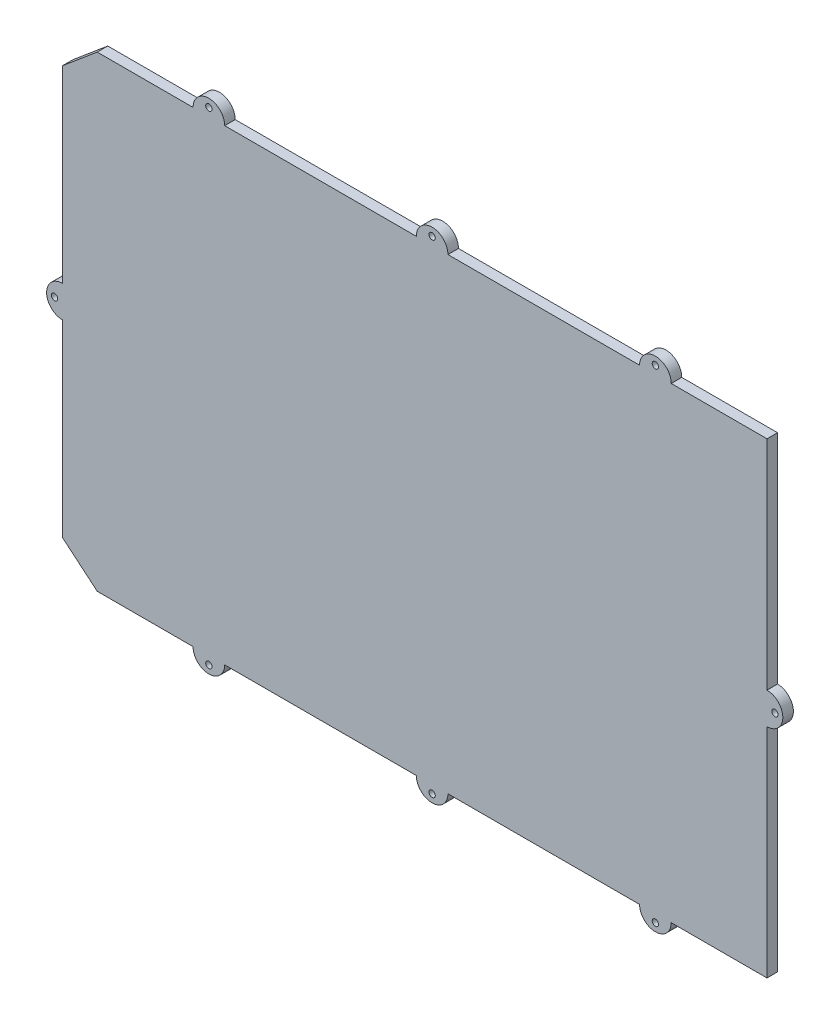
ISO-10303-21;
HEADER;
FILE_DESCRIPTION(('STEP AP214'),'2;1');
FILE_NAME('part.step','',(''),(''),'','','');
FILE_SCHEMA(('AUTOMOTIVE_DESIGN { 1 0 10303 214 1 1 1 1 }'));
ENDSEC;
DATA;
#1=APPLICATION_CONTEXT('core data for automotive mechanical design processes');
#2=APPLICATION_PROTOCOL_DEFINITION('international standard','automotive_design',2000,#1);
#3=PRODUCT_CONTEXT('',#1,'mechanical');
#4=PRODUCT('Part','Part','',(#3));
#5=PRODUCT_RELATED_PRODUCT_CATEGORY('part','',(#4));
#6=PRODUCT_DEFINITION_FORMATION('','',#4);
#7=PRODUCT_DEFINITION_CONTEXT('part definition',#1,'design');
#8=PRODUCT_DEFINITION('design','',#6,#7);
#9=PRODUCT_DEFINITION_SHAPE('','',#8);
#10=(LENGTH_UNIT() NAMED_UNIT(*) SI_UNIT(.MILLI.,.METRE.));
#11=(NAMED_UNIT(*) PLANE_ANGLE_UNIT() SI_UNIT($,.RADIAN.));
#12=(NAMED_UNIT(*) SI_UNIT($,.STERADIAN.) SOLID_ANGLE_UNIT());
#13=UNCERTAINTY_MEASURE_WITH_UNIT(LENGTH_MEASURE(1.E-05),#10,'distance_accuracy_value','');
#14=(GEOMETRIC_REPRESENTATION_CONTEXT(3) GLOBAL_UNCERTAINTY_ASSIGNED_CONTEXT((#13)) GLOBAL_UNIT_ASSIGNED_CONTEXT((#10,
#11,#12)) REPRESENTATION_CONTEXT('',''));
#15=CARTESIAN_POINT('',(0.,0.,0.));
#16=DIRECTION('',(0.,0.,1.));
#17=DIRECTION('',(1.,0.,0.));
#18=AXIS2_PLACEMENT_3D('',#15,#16,#17);
#19=CARTESIAN_POINT('',(319.2,-5.84232335022694,10.));
#20=DIRECTION('',(0.,0.,-1.));
#21=DIRECTION('',(-1.,0.,0.));
#22=AXIS2_PLACEMENT_3D('',#19,#20,#21);
#23=PLANE('',#22);
#24=DIRECTION('',(1.,0.,0.));
#25=VECTOR('',#24,1.);
#26=CARTESIAN_POINT('',(228.3,-227.342323350227,10.));
#27=LINE('',#26,#25);
#28=CARTESIAN_POINT('',(228.3,-227.342323350227,10.));
#29=VERTEX_POINT('',#28);
#30=CARTESIAN_POINT('',(319.2,-227.342323350227,10.));
#31=VERTEX_POINT('',#30);
#32=EDGE_CURVE('E290',#29,#31,#27,.T.);
#33=ORIENTED_EDGE('',*,*,#32,.T.);
#34=DIRECTION('',(0.,1.,0.));
#35=VECTOR('',#34,1.);
#36=CARTESIAN_POINT('',(319.2,-227.342323350227,10.));
#37=LINE('',#36,#35);
#38=CARTESIAN_POINT('',(319.2,-20.8423233502269,10.));
#39=VERTEX_POINT('',#38);
#40=EDGE_CURVE('E142',#31,#39,#37,.T.);
#41=ORIENTED_EDGE('',*,*,#40,.T.);
#42=CARTESIAN_POINT('',(319.2,-5.84232335022694,10.));
#43=DIRECTION('',(0.,0.,1.));
#44=DIRECTION('',(-1.,0.,0.));
#45=AXIS2_PLACEMENT_3D('',#42,#43,#44);
#46=CIRCLE('',#45,15.);
#47=CARTESIAN_POINT('',(319.2,9.15767664977306,10.));
#48=VERTEX_POINT('',#47);
#49=EDGE_CURVE('E367',#39,#48,#46,.T.);
#50=ORIENTED_EDGE('',*,*,#49,.T.);
#51=DIRECTION('',(0.,1.,0.));
#52=VECTOR('',#51,1.);
#53=CARTESIAN_POINT('',(319.2,9.15767664977306,10.));
#54=LINE('',#53,#52);
#55=CARTESIAN_POINT('',(319.2,215.657676649773,10.));
#56=VERTEX_POINT('',#55);
#57=EDGE_CURVE('E387',#48,#56,#54,.T.);
#58=ORIENTED_EDGE('',*,*,#57,.T.);
#59=DIRECTION('',(-1.,0.,0.));
#60=VECTOR('',#59,1.);
#61=CARTESIAN_POINT('',(319.2,215.657676649773,10.));
#62=LINE('',#61,#60);
#63=CARTESIAN_POINT('',(228.3,215.657676649773,10.));
#64=VERTEX_POINT('',#63);
#65=EDGE_CURVE('E383',#56,#64,#62,.T.);
#66=ORIENTED_EDGE('',*,*,#65,.T.);
#67=CARTESIAN_POINT('',(213.3,215.657676649773,10.));
#68=DIRECTION('',(0.,0.,1.));
#69=DIRECTION('',(-1.,0.,0.));
#70=AXIS2_PLACEMENT_3D('',#67,#68,#69);
#71=CIRCLE('',#70,15.);
#72=CARTESIAN_POINT('',(198.3,215.657676649773,10.));
#73=VERTEX_POINT('',#72);
#74=EDGE_CURVE('E386',#64,#73,#71,.T.);
#75=ORIENTED_EDGE('',*,*,#74,.T.);
#76=DIRECTION('',(-1.,0.,0.));
#77=VECTOR('',#76,1.);
#78=CARTESIAN_POINT('',(198.3,215.657676649773,10.));
#79=LINE('',#78,#77);
#80=CARTESIAN_POINT('',(16.5000000000001,215.657676649773,10.));
#81=VERTEX_POINT('',#80);
#82=EDGE_CURVE('E391',#73,#81,#79,.T.);
#83=ORIENTED_EDGE('',*,*,#82,.T.);
#84=CARTESIAN_POINT('',(1.50000000000006,215.657676649773,10.));
#85=DIRECTION('',(0.,0.,1.));
#86=DIRECTION('',(-1.,0.,0.));
#87=AXIS2_PLACEMENT_3D('',#84,#85,#86);
#88=CIRCLE('',#87,15.);
#89=CARTESIAN_POINT('',(-13.4999999999999,215.657676649773,10.));
#90=VERTEX_POINT('',#89);
#91=EDGE_CURVE('E398',#81,#90,#88,.T.);
#92=ORIENTED_EDGE('',*,*,#91,.T.);
#93=DIRECTION('',(-1.,0.,0.));
#94=VECTOR('',#93,1.);
#95=CARTESIAN_POINT('',(-13.4999999999999,215.657676649773,10.));
#96=LINE('',#95,#94);
#97=CARTESIAN_POINT('',(-195.3,215.657676649773,10.));
#98=VERTEX_POINT('',#97);
#99=EDGE_CURVE('E401',#90,#98,#96,.T.);
#100=ORIENTED_EDGE('',*,*,#99,.T.);
#101=CARTESIAN_POINT('',(-210.3,215.657676649773,10.));
#102=DIRECTION('',(0.,0.,1.));
#103=DIRECTION('',(-1.,0.,0.));
#104=AXIS2_PLACEMENT_3D('',#101,#102,#103);
#105=CIRCLE('',#104,15.);
#106=CARTESIAN_POINT('',(-225.3,215.657676649773,10.));
#107=VERTEX_POINT('',#106);
#108=EDGE_CURVE('E404',#98,#107,#105,.T.);
#109=ORIENTED_EDGE('',*,*,#108,.T.);
#110=DIRECTION('',(-1.,0.,0.));
#111=VECTOR('',#110,1.);
#112=CARTESIAN_POINT('',(-225.3,215.657676649773,10.));
#113=LINE('',#112,#111);
#114=CARTESIAN_POINT('',(-316.2,215.657676649773,10.));
#115=VERTEX_POINT('',#114);
#116=EDGE_CURVE('E407',#107,#115,#113,.T.);
#117=ORIENTED_EDGE('',*,*,#116,.T.);
#118=DIRECTION('',(-0.766044443118976,-0.642787609686541,0.));
#119=VECTOR('',#118,1.);
#120=CARTESIAN_POINT('',(-316.2,215.657676649773,10.));
#121=LINE('',#120,#119);
#122=CARTESIAN_POINT('',(-349.2,187.967388820923,10.));
#123=VERTEX_POINT('',#122);
#124=EDGE_CURVE('E410',#115,#123,#121,.T.);
#125=ORIENTED_EDGE('',*,*,#124,.T.);
#126=DIRECTION('',(0.,-1.,0.));
#127=VECTOR('',#126,1.);
#128=CARTESIAN_POINT('',(-349.2,187.967388820923,10.));
#129=LINE('',#128,#127);
#130=CARTESIAN_POINT('',(-349.2,9.15767664977306,10.));
#131=VERTEX_POINT('',#130);
#132=EDGE_CURVE('E413',#123,#131,#129,.T.);
#133=ORIENTED_EDGE('',*,*,#132,.T.);
#134=CARTESIAN_POINT('',(-349.2,-5.84232335022694,10.));
#135=DIRECTION('',(0.,0.,1.));
#136=DIRECTION('',(1.,0.,0.));
#137=AXIS2_PLACEMENT_3D('',#134,#135,#136);
#138=CIRCLE('',#137,15.);
#139=CARTESIAN_POINT('',(-349.2,-20.8423233502269,10.));
#140=VERTEX_POINT('',#139);
#141=EDGE_CURVE('E416',#131,#140,#138,.T.);
#142=ORIENTED_EDGE('',*,*,#141,.T.);
#143=DIRECTION('',(0.,-1.,0.));
#144=VECTOR('',#143,1.);
#145=CARTESIAN_POINT('',(-349.2,-20.8423233502269,10.));
#146=LINE('',#145,#144);
#147=CARTESIAN_POINT('',(-349.2,-199.652035521376,10.));
#148=VERTEX_POINT('',#147);
#149=EDGE_CURVE('E419',#140,#148,#146,.T.);
#150=ORIENTED_EDGE('',*,*,#149,.T.);
#151=DIRECTION('',(0.766044443118977,-0.642787609686541,0.));
#152=VECTOR('',#151,1.);
#153=CARTESIAN_POINT('',(-349.2,-199.652035521376,10.));
#154=LINE('',#153,#152);
#155=CARTESIAN_POINT('',(-316.2,-227.342323350227,10.));
#156=VERTEX_POINT('',#155);
#157=EDGE_CURVE('E422',#148,#156,#154,.T.);
#158=ORIENTED_EDGE('',*,*,#157,.T.);
#159=DIRECTION('',(1.,0.,0.));
#160=VECTOR('',#159,1.);
#161=CARTESIAN_POINT('',(-316.2,-227.342323350227,10.));
#162=LINE('',#161,#160);
#163=CARTESIAN_POINT('',(-225.3,-227.342323350227,10.));
#164=VERTEX_POINT('',#163);
#165=EDGE_CURVE('E425',#156,#164,#162,.T.);
#166=ORIENTED_EDGE('',*,*,#165,.T.);
#167=CARTESIAN_POINT('',(-210.3,-227.342323350227,10.));
#168=DIRECTION('',(0.,0.,1.));
#169=DIRECTION('',(1.,0.,0.));
#170=AXIS2_PLACEMENT_3D('',#167,#168,#169);
#171=CIRCLE('',#170,15.);
#172=CARTESIAN_POINT('',(-195.3,-227.342323350227,10.));
#173=VERTEX_POINT('',#172);
#174=EDGE_CURVE('E428',#164,#173,#171,.T.);
#175=ORIENTED_EDGE('',*,*,#174,.T.);
#176=DIRECTION('',(1.,0.,0.));
#177=VECTOR('',#176,1.);
#178=CARTESIAN_POINT('',(-195.3,-227.342323350227,10.));
#179=LINE('',#178,#177);
#180=CARTESIAN_POINT('',(-13.4999999999999,-227.342323350227,10.));
#181=VERTEX_POINT('',#180);
#182=EDGE_CURVE('E203',#173,#181,#179,.T.);
#183=ORIENTED_EDGE('',*,*,#182,.T.);
#184=CARTESIAN_POINT('',(1.50000000000011,-227.342323350227,10.));
#185=DIRECTION('',(0.,0.,1.));
#186=DIRECTION('',(1.,0.,0.));
#187=AXIS2_PLACEMENT_3D('',#184,#185,#186);
#188=CIRCLE('',#187,15.);
#189=CARTESIAN_POINT('',(16.5000000000001,-227.342323350227,10.));
#190=VERTEX_POINT('',#189);
#191=EDGE_CURVE('E197',#181,#190,#188,.T.);
#192=ORIENTED_EDGE('',*,*,#191,.T.);
#193=DIRECTION('',(1.,0.,0.));
#194=VECTOR('',#193,1.);
#195=CARTESIAN_POINT('',(16.5000000000001,-227.342323350227,10.));
#196=LINE('',#195,#194);
#197=CARTESIAN_POINT('',(198.3,-227.342323350227,10.));
#198=VERTEX_POINT('',#197);
#199=EDGE_CURVE('E201',#190,#198,#196,.T.);
#200=ORIENTED_EDGE('',*,*,#199,.T.);
#201=CARTESIAN_POINT('',(213.3,-227.342323350227,10.));
#202=DIRECTION('',(0.,0.,1.));
#203=DIRECTION('',(1.,0.,0.));
#204=AXIS2_PLACEMENT_3D('',#201,#202,#203);
#205=CIRCLE('',#204,15.);
#206=EDGE_CURVE('E57',#198,#29,#205,.T.);
#207=ORIENTED_EDGE('',*,*,#206,.T.);
#208=EDGE_LOOP('',(#33,#41,#50,#58,#66,#75,#83,#92,#100,#109,#117,#125,#133,#142,#150,#158,#166,
#175,#183,#192,#200,#207));
#209=FACE_BOUND('',#208,.T.);
#210=CARTESIAN_POINT('',(-210.3,223.157676649773,10.));
#211=DIRECTION('',(0.,0.,1.));
#212=DIRECTION('',(1.,0.,0.));
#213=AXIS2_PLACEMENT_3D('',#210,#211,#212);
#214=CIRCLE('',#213,3.00000000000006);
#215=CARTESIAN_POINT('',(-207.3,223.157676649773,10.));
#216=VERTEX_POINT('',#215);
#217=EDGE_CURVE('E230',#216,#216,#214,.T.);
#218=ORIENTED_EDGE('',*,*,#217,.F.);
#219=EDGE_LOOP('',(#218));
#220=FACE_BOUND('',#219,.T.);
#221=CARTESIAN_POINT('',(1.50000000000003,223.157676649773,10.));
#222=DIRECTION('',(0.,0.,1.));
#223=DIRECTION('',(1.,0.,0.));
#224=AXIS2_PLACEMENT_3D('',#221,#222,#223);
#225=CIRCLE('',#224,3.);
#226=CARTESIAN_POINT('',(4.50000000000003,223.157676649773,10.));
#227=VERTEX_POINT('',#226);
#228=EDGE_CURVE('E546',#227,#227,#225,.T.);
#229=ORIENTED_EDGE('',*,*,#228,.F.);
#230=EDGE_LOOP('',(#229));
#231=FACE_BOUND('',#230,.T.);
#232=CARTESIAN_POINT('',(213.3,223.157676649773,10.));
#233=DIRECTION('',(0.,0.,1.));
#234=DIRECTION('',(1.,0.,0.));
#235=AXIS2_PLACEMENT_3D('',#232,#233,#234);
#236=CIRCLE('',#235,3.00000000000002);
#237=CARTESIAN_POINT('',(216.3,223.157676649773,10.));
#238=VERTEX_POINT('',#237);
#239=EDGE_CURVE('E538',#238,#238,#236,.T.);
#240=ORIENTED_EDGE('',*,*,#239,.F.);
#241=EDGE_LOOP('',(#240));
#242=FACE_BOUND('',#241,.T.);
#243=CARTESIAN_POINT('',(326.7,-5.84232335022694,10.));
#244=DIRECTION('',(0.,0.,1.));
#245=DIRECTION('',(1.,0.,0.));
#246=AXIS2_PLACEMENT_3D('',#243,#244,#245);
#247=CIRCLE('',#246,2.99999999999999);
#248=CARTESIAN_POINT('',(329.7,-5.84232335022694,10.));
#249=VERTEX_POINT('',#248);
#250=EDGE_CURVE('E530',#249,#249,#247,.T.);
#251=ORIENTED_EDGE('',*,*,#250,.F.);
#252=EDGE_LOOP('',(#251));
#253=FACE_BOUND('',#252,.T.);
#254=CARTESIAN_POINT('',(-356.7,-5.84232335022694,10.));
#255=DIRECTION('',(0.,0.,1.));
#256=DIRECTION('',(1.,0.,0.));
#257=AXIS2_PLACEMENT_3D('',#254,#255,#256);
#258=CIRCLE('',#257,3.00000000000005);
#259=CARTESIAN_POINT('',(-353.7,-5.84232335022694,10.));
#260=VERTEX_POINT('',#259);
#261=EDGE_CURVE('E522',#260,#260,#258,.T.);
#262=ORIENTED_EDGE('',*,*,#261,.F.);
#263=EDGE_LOOP('',(#262));
#264=FACE_BOUND('',#263,.T.);
#265=CARTESIAN_POINT('',(-210.3,-234.842323350227,10.));
#266=DIRECTION('',(0.,0.,1.));
#267=DIRECTION('',(1.,0.,0.));
#268=AXIS2_PLACEMENT_3D('',#265,#266,#267);
#269=CIRCLE('',#268,3.00000000000006);
#270=CARTESIAN_POINT('',(-207.3,-234.842323350227,10.));
#271=VERTEX_POINT('',#270);
#272=EDGE_CURVE('E514',#271,#271,#269,.T.);
#273=ORIENTED_EDGE('',*,*,#272,.F.);
#274=EDGE_LOOP('',(#273));
#275=FACE_BOUND('',#274,.T.);
#276=CARTESIAN_POINT('',(1.50000000000008,-234.842323350227,10.));
#277=DIRECTION('',(0.,0.,1.));
#278=DIRECTION('',(1.,0.,0.));
#279=AXIS2_PLACEMENT_3D('',#276,#277,#278);
#280=CIRCLE('',#279,3.);
#281=CARTESIAN_POINT('',(4.50000000000008,-234.842323350227,10.));
#282=VERTEX_POINT('',#281);
#283=EDGE_CURVE('E506',#282,#282,#280,.T.);
#284=ORIENTED_EDGE('',*,*,#283,.F.);
#285=EDGE_LOOP('',(#284));
#286=FACE_BOUND('',#285,.T.);
#287=CARTESIAN_POINT('',(213.3,-234.842323350227,10.));
#288=DIRECTION('',(0.,0.,1.));
#289=DIRECTION('',(1.,0.,0.));
#290=AXIS2_PLACEMENT_3D('',#287,#288,#289);
#291=CIRCLE('',#290,2.99999999999999);
#292=CARTESIAN_POINT('',(216.3,-234.842323350227,10.));
#293=VERTEX_POINT('',#292);
#294=EDGE_CURVE('E495',#293,#293,#291,.T.);
#295=ORIENTED_EDGE('',*,*,#294,.F.);
#296=EDGE_LOOP('',(#295));
#297=FACE_BOUND('',#296,.T.);
#298=ADVANCED_FACE('F39',(#209,#220,#231,#242,#253,#264,#275,#286,#297),#23,.F.);
#299=CARTESIAN_POINT('',(319.2,-5.84232335022694,0.));
#300=DIRECTION('',(0.,0.,-1.));
#301=DIRECTION('',(-1.,0.,0.));
#302=AXIS2_PLACEMENT_3D('',#299,#300,#301);
#303=PLANE('',#302);
#304=CARTESIAN_POINT('',(1.50000000000008,-234.842323350227,0.));
#305=DIRECTION('',(0.,0.,1.));
#306=DIRECTION('',(1.,0.,0.));
#307=AXIS2_PLACEMENT_3D('',#304,#305,#306);
#308=CIRCLE('',#307,3.);
#309=CARTESIAN_POINT('',(4.50000000000008,-234.842323350227,0.));
#310=VERTEX_POINT('',#309);
#311=EDGE_CURVE('E503',#310,#310,#308,.T.);
#312=ORIENTED_EDGE('',*,*,#311,.T.);
#313=EDGE_LOOP('',(#312));
#314=FACE_BOUND('',#313,.T.);
#315=CARTESIAN_POINT('',(-356.7,-5.84232335022694,0.));
#316=DIRECTION('',(0.,0.,1.));
#317=DIRECTION('',(1.,0.,0.));
#318=AXIS2_PLACEMENT_3D('',#315,#316,#317);
#319=CIRCLE('',#318,3.00000000000005);
#320=CARTESIAN_POINT('',(-353.7,-5.84232335022694,0.));
#321=VERTEX_POINT('',#320);
#322=EDGE_CURVE('E518',#321,#321,#319,.T.);
#323=ORIENTED_EDGE('',*,*,#322,.T.);
#324=EDGE_LOOP('',(#323));
#325=FACE_BOUND('',#324,.T.);
#326=CARTESIAN_POINT('',(213.3,223.157676649773,0.));
#327=DIRECTION('',(0.,0.,1.));
#328=DIRECTION('',(1.,0.,0.));
#329=AXIS2_PLACEMENT_3D('',#326,#327,#328);
#330=CIRCLE('',#329,3.00000000000002);
#331=CARTESIAN_POINT('',(216.3,223.157676649773,0.));
#332=VERTEX_POINT('',#331);
#333=EDGE_CURVE('E534',#332,#332,#330,.T.);
#334=ORIENTED_EDGE('',*,*,#333,.T.);
#335=EDGE_LOOP('',(#334));
#336=FACE_BOUND('',#335,.T.);
#337=CARTESIAN_POINT('',(-210.3,223.157676649773,0.));
#338=DIRECTION('',(0.,0.,1.));
#339=DIRECTION('',(1.,0.,0.));
#340=AXIS2_PLACEMENT_3D('',#337,#338,#339);
#341=CIRCLE('',#340,3.00000000000006);
#342=CARTESIAN_POINT('',(-207.3,223.157676649773,0.));
#343=VERTEX_POINT('',#342);
#344=EDGE_CURVE('E550',#343,#343,#341,.T.);
#345=ORIENTED_EDGE('',*,*,#344,.T.);
#346=EDGE_LOOP('',(#345));
#347=FACE_BOUND('',#346,.T.);
#348=DIRECTION('',(1.,0.,0.));
#349=VECTOR('',#348,1.);
#350=CARTESIAN_POINT('',(228.3,-227.342323350227,0.));
#351=LINE('',#350,#349);
#352=CARTESIAN_POINT('',(228.3,-227.342323350227,0.));
#353=VERTEX_POINT('',#352);
#354=CARTESIAN_POINT('',(319.2,-227.342323350227,0.));
#355=VERTEX_POINT('',#354);
#356=EDGE_CURVE('E225',#353,#355,#351,.T.);
#357=ORIENTED_EDGE('',*,*,#356,.F.);
#358=CARTESIAN_POINT('',(213.3,-227.342323350227,0.));
#359=DIRECTION('',(0.,0.,1.));
#360=DIRECTION('',(1.,0.,0.));
#361=AXIS2_PLACEMENT_3D('',#358,#359,#360);
#362=CIRCLE('',#361,15.);
#363=CARTESIAN_POINT('',(198.3,-227.342323350227,0.));
#364=VERTEX_POINT('',#363);
#365=EDGE_CURVE('E134',#364,#353,#362,.T.);
#366=ORIENTED_EDGE('',*,*,#365,.F.);
#367=DIRECTION('',(1.,0.,0.));
#368=VECTOR('',#367,1.);
#369=CARTESIAN_POINT('',(16.5000000000001,-227.342323350227,0.));
#370=LINE('',#369,#368);
#371=CARTESIAN_POINT('',(16.5000000000001,-227.342323350227,0.));
#372=VERTEX_POINT('',#371);
#373=EDGE_CURVE('E128',#372,#364,#370,.T.);
#374=ORIENTED_EDGE('',*,*,#373,.F.);
#375=CARTESIAN_POINT('',(1.50000000000011,-227.342323350227,0.));
#376=DIRECTION('',(0.,0.,1.));
#377=DIRECTION('',(1.,0.,0.));
#378=AXIS2_PLACEMENT_3D('',#375,#376,#377);
#379=CIRCLE('',#378,15.);
#380=CARTESIAN_POINT('',(-13.4999999999999,-227.342323350227,0.));
#381=VERTEX_POINT('',#380);
#382=EDGE_CURVE('E212',#381,#372,#379,.T.);
#383=ORIENTED_EDGE('',*,*,#382,.F.);
#384=DIRECTION('',(1.,0.,0.));
#385=VECTOR('',#384,1.);
#386=CARTESIAN_POINT('',(-195.3,-227.342323350227,0.));
#387=LINE('',#386,#385);
#388=CARTESIAN_POINT('',(-195.3,-227.342323350227,0.));
#389=VERTEX_POINT('',#388);
#390=EDGE_CURVE('E281',#389,#381,#387,.T.);
#391=ORIENTED_EDGE('',*,*,#390,.F.);
#392=CARTESIAN_POINT('',(-210.3,-227.342323350227,0.));
#393=DIRECTION('',(0.,0.,1.));
#394=DIRECTION('',(1.,0.,0.));
#395=AXIS2_PLACEMENT_3D('',#392,#393,#394);
#396=CIRCLE('',#395,15.);
#397=CARTESIAN_POINT('',(-225.3,-227.342323350227,0.));
#398=VERTEX_POINT('',#397);
#399=EDGE_CURVE('E278',#398,#389,#396,.T.);
#400=ORIENTED_EDGE('',*,*,#399,.F.);
#401=DIRECTION('',(1.,0.,0.));
#402=VECTOR('',#401,1.);
#403=CARTESIAN_POINT('',(-316.2,-227.342323350227,0.));
#404=LINE('',#403,#402);
#405=CARTESIAN_POINT('',(-316.2,-227.342323350227,0.));
#406=VERTEX_POINT('',#405);
#407=EDGE_CURVE('E275',#406,#398,#404,.T.);
#408=ORIENTED_EDGE('',*,*,#407,.F.);
#409=DIRECTION('',(0.766044443118977,-0.642787609686541,0.));
#410=VECTOR('',#409,1.);
#411=CARTESIAN_POINT('',(-349.2,-199.652035521376,0.));
#412=LINE('',#411,#410);
#413=CARTESIAN_POINT('',(-349.2,-199.652035521376,0.));
#414=VERTEX_POINT('',#413);
#415=EDGE_CURVE('E272',#414,#406,#412,.T.);
#416=ORIENTED_EDGE('',*,*,#415,.F.);
#417=DIRECTION('',(0.,-1.,0.));
#418=VECTOR('',#417,1.);
#419=CARTESIAN_POINT('',(-349.2,-20.8423233502269,0.));
#420=LINE('',#419,#418);
#421=CARTESIAN_POINT('',(-349.2,-20.8423233502269,0.));
#422=VERTEX_POINT('',#421);
#423=EDGE_CURVE('E269',#422,#414,#420,.T.);
#424=ORIENTED_EDGE('',*,*,#423,.F.);
#425=CARTESIAN_POINT('',(-349.2,-5.84232335022694,0.));
#426=DIRECTION('',(0.,0.,1.));
#427=DIRECTION('',(1.,0.,0.));
#428=AXIS2_PLACEMENT_3D('',#425,#426,#427);
#429=CIRCLE('',#428,15.);
#430=CARTESIAN_POINT('',(-349.2,9.15767664977306,0.));
#431=VERTEX_POINT('',#430);
#432=EDGE_CURVE('E266',#431,#422,#429,.T.);
#433=ORIENTED_EDGE('',*,*,#432,.F.);
#434=DIRECTION('',(0.,-1.,0.));
#435=VECTOR('',#434,1.);
#436=CARTESIAN_POINT('',(-349.2,187.967388820923,0.));
#437=LINE('',#436,#435);
#438=CARTESIAN_POINT('',(-349.2,187.967388820923,0.));
#439=VERTEX_POINT('',#438);
#440=EDGE_CURVE('E263',#439,#431,#437,.T.);
#441=ORIENTED_EDGE('',*,*,#440,.F.);
#442=DIRECTION('',(-0.766044443118976,-0.642787609686541,0.));
#443=VECTOR('',#442,1.);
#444=CARTESIAN_POINT('',(-316.2,215.657676649773,0.));
#445=LINE('',#444,#443);
#446=CARTESIAN_POINT('',(-316.2,215.657676649773,0.));
#447=VERTEX_POINT('',#446);
#448=EDGE_CURVE('E260',#447,#439,#445,.T.);
#449=ORIENTED_EDGE('',*,*,#448,.F.);
#450=DIRECTION('',(-1.,0.,0.));
#451=VECTOR('',#450,1.);
#452=CARTESIAN_POINT('',(-225.3,215.657676649773,0.));
#453=LINE('',#452,#451);
#454=CARTESIAN_POINT('',(-225.3,215.657676649773,0.));
#455=VERTEX_POINT('',#454);
#456=EDGE_CURVE('E257',#455,#447,#453,.T.);
#457=ORIENTED_EDGE('',*,*,#456,.F.);
#458=CARTESIAN_POINT('',(-210.3,215.657676649773,0.));
#459=DIRECTION('',(0.,0.,1.));
#460=DIRECTION('',(-1.,0.,0.));
#461=AXIS2_PLACEMENT_3D('',#458,#459,#460);
#462=CIRCLE('',#461,15.);
#463=CARTESIAN_POINT('',(-195.3,215.657676649773,0.));
#464=VERTEX_POINT('',#463);
#465=EDGE_CURVE('E254',#464,#455,#462,.T.);
#466=ORIENTED_EDGE('',*,*,#465,.F.);
#467=DIRECTION('',(-1.,0.,0.));
#468=VECTOR('',#467,1.);
#469=CARTESIAN_POINT('',(-13.4999999999999,215.657676649773,0.));
#470=LINE('',#469,#468);
#471=CARTESIAN_POINT('',(-13.4999999999999,215.657676649773,0.));
#472=VERTEX_POINT('',#471);
#473=EDGE_CURVE('E251',#472,#464,#470,.T.);
#474=ORIENTED_EDGE('',*,*,#473,.F.);
#475=CARTESIAN_POINT('',(1.50000000000006,215.657676649773,0.));
#476=DIRECTION('',(0.,0.,1.));
#477=DIRECTION('',(-1.,0.,0.));
#478=AXIS2_PLACEMENT_3D('',#475,#476,#477);
#479=CIRCLE('',#478,15.);
#480=CARTESIAN_POINT('',(16.5000000000001,215.657676649773,0.));
#481=VERTEX_POINT('',#480);
#482=EDGE_CURVE('E248',#481,#472,#479,.T.);
#483=ORIENTED_EDGE('',*,*,#482,.F.);
#484=DIRECTION('',(-1.,0.,0.));
#485=VECTOR('',#484,1.);
#486=CARTESIAN_POINT('',(198.3,215.657676649773,0.));
#487=LINE('',#486,#485);
#488=CARTESIAN_POINT('',(198.3,215.657676649773,0.));
#489=VERTEX_POINT('',#488);
#490=EDGE_CURVE('E245',#489,#481,#487,.T.);
#491=ORIENTED_EDGE('',*,*,#490,.F.);
#492=CARTESIAN_POINT('',(213.3,215.657676649773,0.));
#493=DIRECTION('',(0.,0.,1.));
#494=DIRECTION('',(-1.,0.,0.));
#495=AXIS2_PLACEMENT_3D('',#492,#493,#494);
#496=CIRCLE('',#495,15.);
#497=CARTESIAN_POINT('',(228.3,215.657676649773,0.));
#498=VERTEX_POINT('',#497);
#499=EDGE_CURVE('E242',#498,#489,#496,.T.);
#500=ORIENTED_EDGE('',*,*,#499,.F.);
#501=DIRECTION('',(-1.,0.,0.));
#502=VECTOR('',#501,1.);
#503=CARTESIAN_POINT('',(319.2,215.657676649773,0.));
#504=LINE('',#503,#502);
#505=CARTESIAN_POINT('',(319.2,215.657676649773,0.));
#506=VERTEX_POINT('',#505);
#507=EDGE_CURVE('E239',#506,#498,#504,.T.);
#508=ORIENTED_EDGE('',*,*,#507,.F.);
#509=DIRECTION('',(0.,1.,0.));
#510=VECTOR('',#509,1.);
#511=CARTESIAN_POINT('',(319.2,9.15767664977306,0.));
#512=LINE('',#511,#510);
#513=CARTESIAN_POINT('',(319.2,9.15767664977306,0.));
#514=VERTEX_POINT('',#513);
#515=EDGE_CURVE('E236',#514,#506,#512,.T.);
#516=ORIENTED_EDGE('',*,*,#515,.F.);
#517=CARTESIAN_POINT('',(319.2,-5.84232335022694,0.));
#518=DIRECTION('',(0.,0.,1.));
#519=DIRECTION('',(-1.,0.,0.));
#520=AXIS2_PLACEMENT_3D('',#517,#518,#519);
#521=CIRCLE('',#520,15.);
#522=CARTESIAN_POINT('',(319.2,-20.8423233502269,0.));
#523=VERTEX_POINT('',#522);
#524=EDGE_CURVE('E233',#523,#514,#521,.T.);
#525=ORIENTED_EDGE('',*,*,#524,.F.);
#526=DIRECTION('',(0.,1.,0.));
#527=VECTOR('',#526,1.);
#528=CARTESIAN_POINT('',(319.2,-227.342323350227,0.));
#529=LINE('',#528,#527);
#530=EDGE_CURVE('E229',#355,#523,#529,.T.);
#531=ORIENTED_EDGE('',*,*,#530,.F.);
#532=EDGE_LOOP('',(#357,#366,#374,#383,#391,#400,#408,#416,#424,#433,#441,#449,#457,#466,#474,
#483,#491,#500,#508,#516,#525,#531));
#533=FACE_BOUND('',#532,.T.);
#534=CARTESIAN_POINT('',(1.50000000000003,223.157676649773,0.));
#535=DIRECTION('',(0.,0.,1.));
#536=DIRECTION('',(1.,0.,0.));
#537=AXIS2_PLACEMENT_3D('',#534,#535,#536);
#538=CIRCLE('',#537,3.);
#539=CARTESIAN_POINT('',(4.50000000000003,223.157676649773,0.));
#540=VERTEX_POINT('',#539);
#541=EDGE_CURVE('E542',#540,#540,#538,.T.);
#542=ORIENTED_EDGE('',*,*,#541,.T.);
#543=EDGE_LOOP('',(#542));
#544=FACE_BOUND('',#543,.T.);
#545=CARTESIAN_POINT('',(326.7,-5.84232335022694,0.));
#546=DIRECTION('',(0.,0.,1.));
#547=DIRECTION('',(1.,0.,0.));
#548=AXIS2_PLACEMENT_3D('',#545,#546,#547);
#549=CIRCLE('',#548,2.99999999999999);
#550=CARTESIAN_POINT('',(329.7,-5.84232335022694,0.));
#551=VERTEX_POINT('',#550);
#552=EDGE_CURVE('E526',#551,#551,#549,.T.);
#553=ORIENTED_EDGE('',*,*,#552,.T.);
#554=EDGE_LOOP('',(#553));
#555=FACE_BOUND('',#554,.T.);
#556=CARTESIAN_POINT('',(-210.3,-234.842323350227,0.));
#557=DIRECTION('',(0.,0.,1.));
#558=DIRECTION('',(1.,0.,0.));
#559=AXIS2_PLACEMENT_3D('',#556,#557,#558);
#560=CIRCLE('',#559,3.00000000000006);
#561=CARTESIAN_POINT('',(-207.3,-234.842323350227,0.));
#562=VERTEX_POINT('',#561);
#563=EDGE_CURVE('E510',#562,#562,#560,.T.);
#564=ORIENTED_EDGE('',*,*,#563,.T.);
#565=EDGE_LOOP('',(#564));
#566=FACE_BOUND('',#565,.T.);
#567=CARTESIAN_POINT('',(213.3,-234.842323350227,0.));
#568=DIRECTION('',(0.,0.,1.));
#569=DIRECTION('',(1.,0.,0.));
#570=AXIS2_PLACEMENT_3D('',#567,#568,#569);
#571=CIRCLE('',#570,2.99999999999999);
#572=CARTESIAN_POINT('',(216.3,-234.842323350227,0.));
#573=VERTEX_POINT('',#572);
#574=EDGE_CURVE('E498',#573,#573,#571,.T.);
#575=ORIENTED_EDGE('',*,*,#574,.T.);
#576=EDGE_LOOP('',(#575));
#577=FACE_BOUND('',#576,.T.);
#578=ADVANCED_FACE('F371',(#314,#325,#336,#347,#533,#544,#555,#566,#577),#303,.T.);
#579=CARTESIAN_POINT('',(228.3,-227.342323350227,10.));
#580=DIRECTION('',(0.,1.,0.));
#581=DIRECTION('',(-1.,0.,0.));
#582=AXIS2_PLACEMENT_3D('',#579,#580,#581);
#583=PLANE('',#582);
#584=ORIENTED_EDGE('',*,*,#356,.T.);
#585=DIRECTION('',(0.,0.,-1.));
#586=VECTOR('',#585,1.);
#587=CARTESIAN_POINT('',(319.2,-227.342323350227,10.));
#588=LINE('',#587,#586);
#589=EDGE_CURVE('E11',#31,#355,#588,.T.);
#590=ORIENTED_EDGE('',*,*,#589,.F.);
#591=ORIENTED_EDGE('',*,*,#32,.F.);
#592=DIRECTION('',(0.,0.,-1.));
#593=VECTOR('',#592,1.);
#594=CARTESIAN_POINT('',(228.3,-227.342323350227,10.));
#595=LINE('',#594,#593);
#596=EDGE_CURVE('E221',#29,#353,#595,.T.);
#597=ORIENTED_EDGE('',*,*,#596,.T.);
#598=EDGE_LOOP('',(#584,#590,#591,#597));
#599=FACE_BOUND('',#598,.T.);
#600=ADVANCED_FACE('F41',(#599),#583,.F.);
#601=CARTESIAN_POINT('',(319.2,-227.342323350227,10.));
#602=DIRECTION('',(-1.,0.,0.));
#603=DIRECTION('',(0.,0.,1.));
#604=AXIS2_PLACEMENT_3D('',#601,#602,#603);
#605=PLANE('',#604);
#606=ORIENTED_EDGE('',*,*,#530,.T.);
#607=DIRECTION('',(0.,0.,-1.));
#608=VECTOR('',#607,1.);
#609=CARTESIAN_POINT('',(319.2,-20.8423233502269,10.));
#610=LINE('',#609,#608);
#611=EDGE_CURVE('E49',#39,#523,#610,.T.);
#612=ORIENTED_EDGE('',*,*,#611,.F.);
#613=ORIENTED_EDGE('',*,*,#40,.F.);
#614=ORIENTED_EDGE('',*,*,#589,.T.);
#615=EDGE_LOOP('',(#606,#612,#613,#614));
#616=FACE_BOUND('',#615,.T.);
#617=ADVANCED_FACE('F804',(#616),#605,.F.);
#618=CARTESIAN_POINT('',(319.2,-5.84232335022694,10.));
#619=DIRECTION('',(0.,0.,-1.));
#620=DIRECTION('',(-1.,0.,0.));
#621=AXIS2_PLACEMENT_3D('',#618,#619,#620);
#622=CYLINDRICAL_SURFACE('',#621,15.);
#623=ORIENTED_EDGE('',*,*,#524,.T.);
#624=DIRECTION('',(0.,0.,-1.));
#625=VECTOR('',#624,1.);
#626=CARTESIAN_POINT('',(319.2,9.15767664977306,10.));
#627=LINE('',#626,#625);
#628=EDGE_CURVE('E357',#48,#514,#627,.T.);
#629=ORIENTED_EDGE('',*,*,#628,.F.);
#630=ORIENTED_EDGE('',*,*,#49,.F.);
#631=ORIENTED_EDGE('',*,*,#611,.T.);
#632=EDGE_LOOP('',(#623,#629,#630,#631));
#633=FACE_BOUND('',#632,.T.);
#634=ADVANCED_FACE('F365',(#633),#622,.T.);
#635=CARTESIAN_POINT('',(319.2,9.15767664977306,10.));
#636=DIRECTION('',(-1.,0.,0.));
#637=DIRECTION('',(0.,-1.,0.));
#638=AXIS2_PLACEMENT_3D('',#635,#636,#637);
#639=PLANE('',#638);
#640=ORIENTED_EDGE('',*,*,#515,.T.);
#641=DIRECTION('',(0.,0.,-1.));
#642=VECTOR('',#641,1.);
#643=CARTESIAN_POINT('',(319.2,215.657676649773,10.));
#644=LINE('',#643,#642);
#645=EDGE_CURVE('E353',#56,#506,#644,.T.);
#646=ORIENTED_EDGE('',*,*,#645,.F.);
#647=ORIENTED_EDGE('',*,*,#57,.F.);
#648=ORIENTED_EDGE('',*,*,#628,.T.);
#649=EDGE_LOOP('',(#640,#646,#647,#648));
#650=FACE_BOUND('',#649,.T.);
#651=ADVANCED_FACE('F377',(#650),#639,.F.);
#652=CARTESIAN_POINT('',(319.2,215.657676649773,10.));
#653=DIRECTION('',(0.,-1.,0.));
#654=DIRECTION('',(1.,0.,0.));
#655=AXIS2_PLACEMENT_3D('',#652,#653,#654);
#656=PLANE('',#655);
#657=ORIENTED_EDGE('',*,*,#507,.T.);
#658=DIRECTION('',(0.,0.,-1.));
#659=VECTOR('',#658,1.);
#660=CARTESIAN_POINT('',(228.3,215.657676649773,10.));
#661=LINE('',#660,#659);
#662=EDGE_CURVE('E349',#64,#498,#661,.T.);
#663=ORIENTED_EDGE('',*,*,#662,.F.);
#664=ORIENTED_EDGE('',*,*,#65,.F.);
#665=ORIENTED_EDGE('',*,*,#645,.T.);
#666=EDGE_LOOP('',(#657,#663,#664,#665));
#667=FACE_BOUND('',#666,.T.);
#668=ADVANCED_FACE('F381',(#667),#656,.F.);
#669=CARTESIAN_POINT('',(213.3,215.657676649773,10.));
#670=DIRECTION('',(0.,0.,-1.));
#671=DIRECTION('',(-1.,0.,0.));
#672=AXIS2_PLACEMENT_3D('',#669,#670,#671);
#673=CYLINDRICAL_SURFACE('',#672,15.);
#674=ORIENTED_EDGE('',*,*,#499,.T.);
#675=DIRECTION('',(0.,0.,-1.));
#676=VECTOR('',#675,1.);
#677=CARTESIAN_POINT('',(198.3,215.657676649773,10.));
#678=LINE('',#677,#676);
#679=EDGE_CURVE('E345',#73,#489,#678,.T.);
#680=ORIENTED_EDGE('',*,*,#679,.F.);
#681=ORIENTED_EDGE('',*,*,#74,.F.);
#682=ORIENTED_EDGE('',*,*,#662,.T.);
#683=EDGE_LOOP('',(#674,#680,#681,#682));
#684=FACE_BOUND('',#683,.T.);
#685=ADVANCED_FACE('F769',(#684),#673,.T.);
#686=CARTESIAN_POINT('',(198.3,215.657676649773,10.));
#687=DIRECTION('',(0.,-1.,0.));
#688=DIRECTION('',(1.,0.,0.));
#689=AXIS2_PLACEMENT_3D('',#686,#687,#688);
#690=PLANE('',#689);
#691=ORIENTED_EDGE('',*,*,#490,.T.);
#692=DIRECTION('',(0.,0.,-1.));
#693=VECTOR('',#692,1.);
#694=CARTESIAN_POINT('',(16.5000000000001,215.657676649773,10.));
#695=LINE('',#694,#693);
#696=EDGE_CURVE('E341',#81,#481,#695,.T.);
#697=ORIENTED_EDGE('',*,*,#696,.F.);
#698=ORIENTED_EDGE('',*,*,#82,.F.);
#699=ORIENTED_EDGE('',*,*,#679,.T.);
#700=EDGE_LOOP('',(#691,#697,#698,#699));
#701=FACE_BOUND('',#700,.T.);
#702=ADVANCED_FACE('F759',(#701),#690,.F.);
#703=CARTESIAN_POINT('',(1.50000000000006,215.657676649773,10.));
#704=DIRECTION('',(0.,0.,-1.));
#705=DIRECTION('',(-1.,0.,0.));
#706=AXIS2_PLACEMENT_3D('',#703,#704,#705);
#707=CYLINDRICAL_SURFACE('',#706,15.);
#708=ORIENTED_EDGE('',*,*,#482,.T.);
#709=DIRECTION('',(0.,0.,-1.));
#710=VECTOR('',#709,1.);
#711=CARTESIAN_POINT('',(-13.4999999999999,215.657676649773,10.));
#712=LINE('',#711,#710);
#713=EDGE_CURVE('E337',#90,#472,#712,.T.);
#714=ORIENTED_EDGE('',*,*,#713,.F.);
#715=ORIENTED_EDGE('',*,*,#91,.F.);
#716=ORIENTED_EDGE('',*,*,#696,.T.);
#717=EDGE_LOOP('',(#708,#714,#715,#716));
#718=FACE_BOUND('',#717,.T.);
#719=ADVANCED_FACE('F749',(#718),#707,.T.);
#720=CARTESIAN_POINT('',(-13.4999999999999,215.657676649773,10.));
#721=DIRECTION('',(0.,-1.,0.));
#722=DIRECTION('',(1.,0.,0.));
#723=AXIS2_PLACEMENT_3D('',#720,#721,#722);
#724=PLANE('',#723);
#725=ORIENTED_EDGE('',*,*,#473,.T.);
#726=DIRECTION('',(0.,0.,-1.));
#727=VECTOR('',#726,1.);
#728=CARTESIAN_POINT('',(-195.3,215.657676649773,10.));
#729=LINE('',#728,#727);
#730=EDGE_CURVE('E333',#98,#464,#729,.T.);
#731=ORIENTED_EDGE('',*,*,#730,.F.);
#732=ORIENTED_EDGE('',*,*,#99,.F.);
#733=ORIENTED_EDGE('',*,*,#713,.T.);
#734=EDGE_LOOP('',(#725,#731,#732,#733));
#735=FACE_BOUND('',#734,.T.);
#736=ADVANCED_FACE('F739',(#735),#724,.F.);
#737=CARTESIAN_POINT('',(-210.3,215.657676649773,10.));
#738=DIRECTION('',(0.,0.,-1.));
#739=DIRECTION('',(-1.,0.,0.));
#740=AXIS2_PLACEMENT_3D('',#737,#738,#739);
#741=CYLINDRICAL_SURFACE('',#740,15.);
#742=ORIENTED_EDGE('',*,*,#465,.T.);
#743=DIRECTION('',(0.,0.,-1.));
#744=VECTOR('',#743,1.);
#745=CARTESIAN_POINT('',(-225.3,215.657676649773,10.));
#746=LINE('',#745,#744);
#747=EDGE_CURVE('E329',#107,#455,#746,.T.);
#748=ORIENTED_EDGE('',*,*,#747,.F.);
#749=ORIENTED_EDGE('',*,*,#108,.F.);
#750=ORIENTED_EDGE('',*,*,#730,.T.);
#751=EDGE_LOOP('',(#742,#748,#749,#750));
#752=FACE_BOUND('',#751,.T.);
#753=ADVANCED_FACE('F729',(#752),#741,.T.);
#754=CARTESIAN_POINT('',(-225.3,215.657676649773,10.));
#755=DIRECTION('',(0.,-1.,0.));
#756=DIRECTION('',(1.,0.,0.));
#757=AXIS2_PLACEMENT_3D('',#754,#755,#756);
#758=PLANE('',#757);
#759=ORIENTED_EDGE('',*,*,#456,.T.);
#760=DIRECTION('',(0.,0.,-1.));
#761=VECTOR('',#760,1.);
#762=CARTESIAN_POINT('',(-316.2,215.657676649773,10.));
#763=LINE('',#762,#761);
#764=EDGE_CURVE('E325',#115,#447,#763,.T.);
#765=ORIENTED_EDGE('',*,*,#764,.F.);
#766=ORIENTED_EDGE('',*,*,#116,.F.);
#767=ORIENTED_EDGE('',*,*,#747,.T.);
#768=EDGE_LOOP('',(#759,#765,#766,#767));
#769=FACE_BOUND('',#768,.T.);
#770=ADVANCED_FACE('F719',(#769),#758,.F.);
#771=CARTESIAN_POINT('',(-316.2,215.657676649773,10.));
#772=DIRECTION('',(0.642787609686541,-0.766044443118976,0.));
#773=DIRECTION('',(0.766044443118976,0.642787609686541,0.));
#774=AXIS2_PLACEMENT_3D('',#771,#772,#773);
#775=PLANE('',#774);
#776=ORIENTED_EDGE('',*,*,#448,.T.);
#777=DIRECTION('',(0.,0.,-1.));
#778=VECTOR('',#777,1.);
#779=CARTESIAN_POINT('',(-349.2,187.967388820923,10.));
#780=LINE('',#779,#778);
#781=EDGE_CURVE('E321',#123,#439,#780,.T.);
#782=ORIENTED_EDGE('',*,*,#781,.F.);
#783=ORIENTED_EDGE('',*,*,#124,.F.);
#784=ORIENTED_EDGE('',*,*,#764,.T.);
#785=EDGE_LOOP('',(#776,#782,#783,#784));
#786=FACE_BOUND('',#785,.T.);
#787=ADVANCED_FACE('F709',(#786),#775,.F.);
#788=CARTESIAN_POINT('',(-349.2,187.967388820923,10.));
#789=DIRECTION('',(1.,0.,0.));
#790=DIRECTION('',(0.,1.,0.));
#791=AXIS2_PLACEMENT_3D('',#788,#789,#790);
#792=PLANE('',#791);
#793=ORIENTED_EDGE('',*,*,#440,.T.);
#794=DIRECTION('',(0.,0.,-1.));
#795=VECTOR('',#794,1.);
#796=CARTESIAN_POINT('',(-349.2,9.15767664977306,10.));
#797=LINE('',#796,#795);
#798=EDGE_CURVE('E317',#131,#431,#797,.T.);
#799=ORIENTED_EDGE('',*,*,#798,.F.);
#800=ORIENTED_EDGE('',*,*,#132,.F.);
#801=ORIENTED_EDGE('',*,*,#781,.T.);
#802=EDGE_LOOP('',(#793,#799,#800,#801));
#803=FACE_BOUND('',#802,.T.);
#804=ADVANCED_FACE('F699',(#803),#792,.F.);
#805=CARTESIAN_POINT('',(-349.2,-5.84232335022694,10.));
#806=DIRECTION('',(0.,0.,-1.));
#807=DIRECTION('',(-1.,0.,0.));
#808=AXIS2_PLACEMENT_3D('',#805,#806,#807);
#809=CYLINDRICAL_SURFACE('',#808,15.);
#810=ORIENTED_EDGE('',*,*,#432,.T.);
#811=DIRECTION('',(0.,0.,-1.));
#812=VECTOR('',#811,1.);
#813=CARTESIAN_POINT('',(-349.2,-20.8423233502269,10.));
#814=LINE('',#813,#812);
#815=EDGE_CURVE('E313',#140,#422,#814,.T.);
#816=ORIENTED_EDGE('',*,*,#815,.F.);
#817=ORIENTED_EDGE('',*,*,#141,.F.);
#818=ORIENTED_EDGE('',*,*,#798,.T.);
#819=EDGE_LOOP('',(#810,#816,#817,#818));
#820=FACE_BOUND('',#819,.T.);
#821=ADVANCED_FACE('F689',(#820),#809,.T.);
#822=CARTESIAN_POINT('',(-349.2,-20.8423233502269,10.));
#823=DIRECTION('',(1.,0.,0.));
#824=DIRECTION('',(0.,1.,0.));
#825=AXIS2_PLACEMENT_3D('',#822,#823,#824);
#826=PLANE('',#825);
#827=ORIENTED_EDGE('',*,*,#423,.T.);
#828=DIRECTION('',(0.,0.,-1.));
#829=VECTOR('',#828,1.);
#830=CARTESIAN_POINT('',(-349.2,-199.652035521376,10.));
#831=LINE('',#830,#829);
#832=EDGE_CURVE('E309',#148,#414,#831,.T.);
#833=ORIENTED_EDGE('',*,*,#832,.F.);
#834=ORIENTED_EDGE('',*,*,#149,.F.);
#835=ORIENTED_EDGE('',*,*,#815,.T.);
#836=EDGE_LOOP('',(#827,#833,#834,#835));
#837=FACE_BOUND('',#836,.T.);
#838=ADVANCED_FACE('F679',(#837),#826,.F.);
#839=CARTESIAN_POINT('',(-349.2,-199.652035521376,10.));
#840=DIRECTION('',(0.642787609686541,0.766044443118977,0.));
#841=DIRECTION('',(-0.766044443118977,0.642787609686541,0.));
#842=AXIS2_PLACEMENT_3D('',#839,#840,#841);
#843=PLANE('',#842);
#844=ORIENTED_EDGE('',*,*,#415,.T.);
#845=DIRECTION('',(0.,0.,-1.));
#846=VECTOR('',#845,1.);
#847=CARTESIAN_POINT('',(-316.2,-227.342323350227,10.));
#848=LINE('',#847,#846);
#849=EDGE_CURVE('E305',#156,#406,#848,.T.);
#850=ORIENTED_EDGE('',*,*,#849,.F.);
#851=ORIENTED_EDGE('',*,*,#157,.F.);
#852=ORIENTED_EDGE('',*,*,#832,.T.);
#853=EDGE_LOOP('',(#844,#850,#851,#852));
#854=FACE_BOUND('',#853,.T.);
#855=ADVANCED_FACE('F669',(#854),#843,.F.);
#856=CARTESIAN_POINT('',(-316.2,-227.342323350227,10.));
#857=DIRECTION('',(0.,1.,0.));
#858=DIRECTION('',(0.,0.,1.));
#859=AXIS2_PLACEMENT_3D('',#856,#857,#858);
#860=PLANE('',#859);
#861=ORIENTED_EDGE('',*,*,#407,.T.);
#862=DIRECTION('',(0.,0.,-1.));
#863=VECTOR('',#862,1.);
#864=CARTESIAN_POINT('',(-225.3,-227.342323350227,10.));
#865=LINE('',#864,#863);
#866=EDGE_CURVE('E301',#164,#398,#865,.T.);
#867=ORIENTED_EDGE('',*,*,#866,.F.);
#868=ORIENTED_EDGE('',*,*,#165,.F.);
#869=ORIENTED_EDGE('',*,*,#849,.T.);
#870=EDGE_LOOP('',(#861,#867,#868,#869));
#871=FACE_BOUND('',#870,.T.);
#872=ADVANCED_FACE('F660',(#871),#860,.F.);
#873=CARTESIAN_POINT('',(-210.3,-227.342323350227,10.));
#874=DIRECTION('',(0.,0.,-1.));
#875=DIRECTION('',(-1.,0.,0.));
#876=AXIS2_PLACEMENT_3D('',#873,#874,#875);
#877=CYLINDRICAL_SURFACE('',#876,15.);
#878=ORIENTED_EDGE('',*,*,#399,.T.);
#879=DIRECTION('',(0.,0.,-1.));
#880=VECTOR('',#879,1.);
#881=CARTESIAN_POINT('',(-195.3,-227.342323350227,10.));
#882=LINE('',#881,#880);
#883=EDGE_CURVE('E297',#173,#389,#882,.T.);
#884=ORIENTED_EDGE('',*,*,#883,.F.);
#885=ORIENTED_EDGE('',*,*,#174,.F.);
#886=ORIENTED_EDGE('',*,*,#866,.T.);
#887=EDGE_LOOP('',(#878,#884,#885,#886));
#888=FACE_BOUND('',#887,.T.);
#889=ADVANCED_FACE('F436',(#888),#877,.T.);
#890=CARTESIAN_POINT('',(-195.3,-227.342323350227,10.));
#891=DIRECTION('',(0.,1.,0.));
#892=DIRECTION('',(0.,0.,1.));
#893=AXIS2_PLACEMENT_3D('',#890,#891,#892);
#894=PLANE('',#893);
#895=ORIENTED_EDGE('',*,*,#390,.T.);
#896=DIRECTION('',(0.,0.,-1.));
#897=VECTOR('',#896,1.);
#898=CARTESIAN_POINT('',(-13.4999999999999,-227.342323350227,10.));
#899=LINE('',#898,#897);
#900=EDGE_CURVE('E214',#181,#381,#899,.T.);
#901=ORIENTED_EDGE('',*,*,#900,.F.);
#902=ORIENTED_EDGE('',*,*,#182,.F.);
#903=ORIENTED_EDGE('',*,*,#883,.T.);
#904=EDGE_LOOP('',(#895,#901,#902,#903));
#905=FACE_BOUND('',#904,.T.);
#906=ADVANCED_FACE('F440',(#905),#894,.F.);
#907=CARTESIAN_POINT('',(1.50000000000011,-227.342323350227,10.));
#908=DIRECTION('',(0.,0.,-1.));
#909=DIRECTION('',(-1.,0.,0.));
#910=AXIS2_PLACEMENT_3D('',#907,#908,#909);
#911=CYLINDRICAL_SURFACE('',#910,15.);
#912=ORIENTED_EDGE('',*,*,#382,.T.);
#913=DIRECTION('',(0.,0.,-1.));
#914=VECTOR('',#913,1.);
#915=CARTESIAN_POINT('',(16.5000000000001,-227.342323350227,10.));
#916=LINE('',#915,#914);
#917=EDGE_CURVE('E209',#190,#372,#916,.T.);
#918=ORIENTED_EDGE('',*,*,#917,.F.);
#919=ORIENTED_EDGE('',*,*,#191,.F.);
#920=ORIENTED_EDGE('',*,*,#900,.T.);
#921=EDGE_LOOP('',(#912,#918,#919,#920));
#922=FACE_BOUND('',#921,.T.);
#923=ADVANCED_FACE('F210',(#922),#911,.T.);
#924=CARTESIAN_POINT('',(16.5000000000001,-227.342323350227,10.));
#925=DIRECTION('',(0.,1.,0.));
#926=DIRECTION('',(0.,0.,1.));
#927=AXIS2_PLACEMENT_3D('',#924,#925,#926);
#928=PLANE('',#927);
#929=ORIENTED_EDGE('',*,*,#373,.T.);
#930=DIRECTION('',(0.,0.,-1.));
#931=VECTOR('',#930,1.);
#932=CARTESIAN_POINT('',(198.3,-227.342323350227,10.));
#933=LINE('',#932,#931);
#934=EDGE_CURVE('E215',#198,#364,#933,.T.);
#935=ORIENTED_EDGE('',*,*,#934,.F.);
#936=ORIENTED_EDGE('',*,*,#199,.F.);
#937=ORIENTED_EDGE('',*,*,#917,.T.);
#938=EDGE_LOOP('',(#929,#935,#936,#937));
#939=FACE_BOUND('',#938,.T.);
#940=ADVANCED_FACE('F217',(#939),#928,.F.);
#941=CARTESIAN_POINT('',(213.3,-227.342323350227,10.));
#942=DIRECTION('',(0.,0.,-1.));
#943=DIRECTION('',(-1.,0.,0.));
#944=AXIS2_PLACEMENT_3D('',#941,#942,#943);
#945=CYLINDRICAL_SURFACE('',#944,15.);
#946=ORIENTED_EDGE('',*,*,#365,.T.);
#947=ORIENTED_EDGE('',*,*,#596,.F.);
#948=ORIENTED_EDGE('',*,*,#206,.F.);
#949=ORIENTED_EDGE('',*,*,#934,.T.);
#950=EDGE_LOOP('',(#946,#947,#948,#949));
#951=FACE_BOUND('',#950,.T.);
#952=ADVANCED_FACE('F444',(#951),#945,.T.);
#953=CARTESIAN_POINT('',(-210.3,223.157676649773,10.));
#954=DIRECTION('',(0.,0.,-1.));
#955=DIRECTION('',(-1.,0.,0.));
#956=AXIS2_PLACEMENT_3D('',#953,#954,#955);
#957=CYLINDRICAL_SURFACE('',#956,3.00000000000006);
#958=ORIENTED_EDGE('',*,*,#217,.T.);
#959=EDGE_LOOP('',(#958));
#960=FACE_BOUND('',#959,.T.);
#961=ORIENTED_EDGE('',*,*,#344,.F.);
#962=EDGE_LOOP('',(#961));
#963=FACE_BOUND('',#962,.T.);
#964=ADVANCED_FACE('F446',(#960,#963),#957,.F.);
#965=CARTESIAN_POINT('',(1.50000000000003,223.157676649773,10.));
#966=DIRECTION('',(0.,0.,-1.));
#967=DIRECTION('',(-1.,0.,0.));
#968=AXIS2_PLACEMENT_3D('',#965,#966,#967);
#969=CYLINDRICAL_SURFACE('',#968,3.);
#970=ORIENTED_EDGE('',*,*,#228,.T.);
#971=EDGE_LOOP('',(#970));
#972=FACE_BOUND('',#971,.T.);
#973=ORIENTED_EDGE('',*,*,#541,.F.);
#974=EDGE_LOOP('',(#973));
#975=FACE_BOUND('',#974,.T.);
#976=ADVANCED_FACE('F452',(#972,#975),#969,.F.);
#977=CARTESIAN_POINT('',(213.3,223.157676649773,10.));
#978=DIRECTION('',(0.,0.,-1.));
#979=DIRECTION('',(-1.,0.,0.));
#980=AXIS2_PLACEMENT_3D('',#977,#978,#979);
#981=CYLINDRICAL_SURFACE('',#980,3.00000000000002);
#982=ORIENTED_EDGE('',*,*,#239,.T.);
#983=EDGE_LOOP('',(#982));
#984=FACE_BOUND('',#983,.T.);
#985=ORIENTED_EDGE('',*,*,#333,.F.);
#986=EDGE_LOOP('',(#985));
#987=FACE_BOUND('',#986,.T.);
#988=ADVANCED_FACE('F466',(#984,#987),#981,.F.);
#989=CARTESIAN_POINT('',(326.7,-5.84232335022694,10.));
#990=DIRECTION('',(0.,0.,-1.));
#991=DIRECTION('',(-1.,0.,0.));
#992=AXIS2_PLACEMENT_3D('',#989,#990,#991);
#993=CYLINDRICAL_SURFACE('',#992,2.99999999999999);
#994=ORIENTED_EDGE('',*,*,#250,.T.);
#995=EDGE_LOOP('',(#994));
#996=FACE_BOUND('',#995,.T.);
#997=ORIENTED_EDGE('',*,*,#552,.F.);
#998=EDGE_LOOP('',(#997));
#999=FACE_BOUND('',#998,.T.);
#1000=ADVANCED_FACE('F470',(#996,#999),#993,.F.);
#1001=CARTESIAN_POINT('',(-356.7,-5.84232335022694,10.));
#1002=DIRECTION('',(0.,0.,-1.));
#1003=DIRECTION('',(-1.,0.,0.));
#1004=AXIS2_PLACEMENT_3D('',#1001,#1002,#1003);
#1005=CYLINDRICAL_SURFACE('',#1004,3.00000000000005);
#1006=ORIENTED_EDGE('',*,*,#261,.T.);
#1007=EDGE_LOOP('',(#1006));
#1008=FACE_BOUND('',#1007,.T.);
#1009=ORIENTED_EDGE('',*,*,#322,.F.);
#1010=EDGE_LOOP('',(#1009));
#1011=FACE_BOUND('',#1010,.T.);
#1012=ADVANCED_FACE('F474',(#1008,#1011),#1005,.F.);
#1013=CARTESIAN_POINT('',(-210.3,-234.842323350227,10.));
#1014=DIRECTION('',(0.,0.,-1.));
#1015=DIRECTION('',(-1.,0.,0.));
#1016=AXIS2_PLACEMENT_3D('',#1013,#1014,#1015);
#1017=CYLINDRICAL_SURFACE('',#1016,3.00000000000006);
#1018=ORIENTED_EDGE('',*,*,#272,.T.);
#1019=EDGE_LOOP('',(#1018));
#1020=FACE_BOUND('',#1019,.T.);
#1021=ORIENTED_EDGE('',*,*,#563,.F.);
#1022=EDGE_LOOP('',(#1021));
#1023=FACE_BOUND('',#1022,.T.);
#1024=ADVANCED_FACE('F478',(#1020,#1023),#1017,.F.);
#1025=CARTESIAN_POINT('',(1.50000000000008,-234.842323350227,10.));
#1026=DIRECTION('',(0.,0.,-1.));
#1027=DIRECTION('',(-1.,0.,0.));
#1028=AXIS2_PLACEMENT_3D('',#1025,#1026,#1027);
#1029=CYLINDRICAL_SURFACE('',#1028,3.);
#1030=ORIENTED_EDGE('',*,*,#283,.T.);
#1031=EDGE_LOOP('',(#1030));
#1032=FACE_BOUND('',#1031,.T.);
#1033=ORIENTED_EDGE('',*,*,#311,.F.);
#1034=EDGE_LOOP('',(#1033));
#1035=FACE_BOUND('',#1034,.T.);
#1036=ADVANCED_FACE('F482',(#1032,#1035),#1029,.F.);
#1037=CARTESIAN_POINT('',(213.3,-234.842323350227,10.));
#1038=DIRECTION('',(0.,0.,-1.));
#1039=DIRECTION('',(-1.,0.,0.));
#1040=AXIS2_PLACEMENT_3D('',#1037,#1038,#1039);
#1041=CYLINDRICAL_SURFACE('',#1040,2.99999999999999);
#1042=ORIENTED_EDGE('',*,*,#294,.T.);
#1043=EDGE_LOOP('',(#1042));
#1044=FACE_BOUND('',#1043,.T.);
#1045=ORIENTED_EDGE('',*,*,#574,.F.);
#1046=EDGE_LOOP('',(#1045));
#1047=FACE_BOUND('',#1046,.T.);
#1048=ADVANCED_FACE('F486',(#1044,#1047),#1041,.F.);
#1049=CLOSED_SHELL('',(#298,#578,#600,#617,#634,#651,#668,#685,#702,#719,#736,#753,#770,#787,
#804,#821,#838,#855,#872,#889,#906,#923,#940,#952,#964,#976,#988,#1000,#1012,#1024,#1036,#1048));
#1050=MANIFOLD_SOLID_BREP('B2',#1049);
#1051=ADVANCED_BREP_SHAPE_REPRESENTATION('',(#18,#1050),#14);
#1052=SHAPE_DEFINITION_REPRESENTATION(#9,#1051);
ENDSEC;
END-ISO-10303-21;
